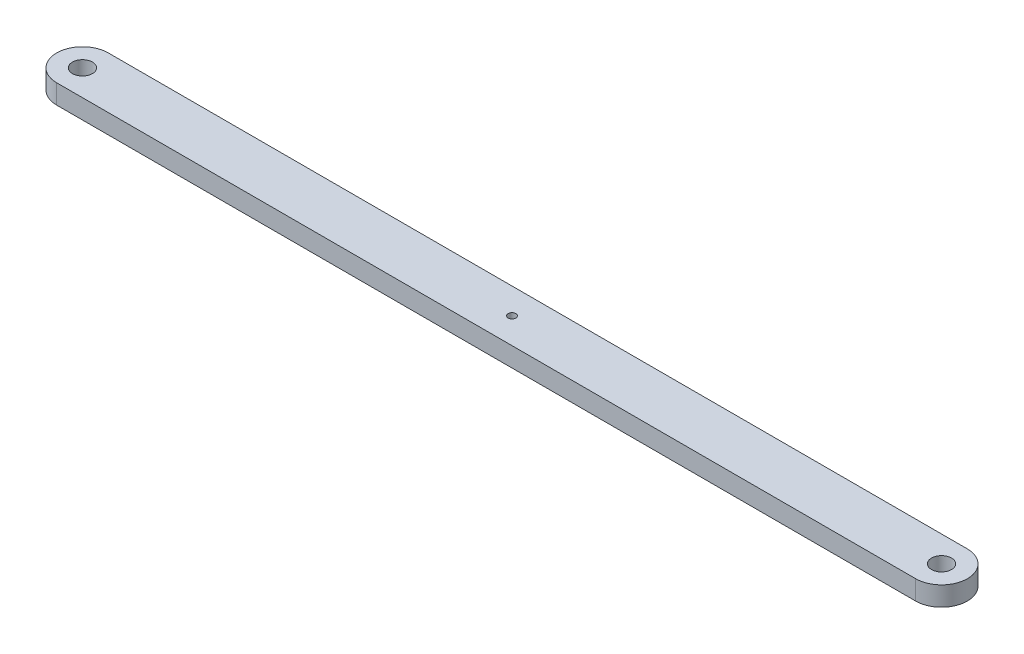
ISO-10303-21;
HEADER;
FILE_DESCRIPTION(('STEP AP214'),'2;1');
FILE_NAME('part.step','',(''),(''),'','','');
FILE_SCHEMA(('AUTOMOTIVE_DESIGN { 1 0 10303 214 1 1 1 1 }'));
ENDSEC;
DATA;
#1=APPLICATION_CONTEXT('core data for automotive mechanical design processes');
#2=APPLICATION_PROTOCOL_DEFINITION('international standard','automotive_design',2000,#1);
#3=PRODUCT_CONTEXT('',#1,'mechanical');
#4=PRODUCT('Part','Part','',(#3));
#5=PRODUCT_RELATED_PRODUCT_CATEGORY('part','',(#4));
#6=PRODUCT_DEFINITION_FORMATION('','',#4);
#7=PRODUCT_DEFINITION_CONTEXT('part definition',#1,'design');
#8=PRODUCT_DEFINITION('design','',#6,#7);
#9=PRODUCT_DEFINITION_SHAPE('','',#8);
#10=(LENGTH_UNIT() NAMED_UNIT(*) SI_UNIT(.MILLI.,.METRE.));
#11=(NAMED_UNIT(*) PLANE_ANGLE_UNIT() SI_UNIT($,.RADIAN.));
#12=(NAMED_UNIT(*) SI_UNIT($,.STERADIAN.) SOLID_ANGLE_UNIT());
#13=UNCERTAINTY_MEASURE_WITH_UNIT(LENGTH_MEASURE(1.E-05),#10,'distance_accuracy_value','');
#14=(GEOMETRIC_REPRESENTATION_CONTEXT(3) GLOBAL_UNCERTAINTY_ASSIGNED_CONTEXT((#13)) GLOBAL_UNIT_ASSIGNED_CONTEXT((#10,
#11,#12)) REPRESENTATION_CONTEXT('',''));
#15=CARTESIAN_POINT('',(0.,0.,0.));
#16=DIRECTION('',(0.,0.,1.));
#17=DIRECTION('',(1.,0.,0.));
#18=AXIS2_PLACEMENT_3D('',#15,#16,#17);
#19=CARTESIAN_POINT('',(66.5,3.,0.));
#20=DIRECTION('',(0.,-1.,0.));
#21=DIRECTION('',(0.,0.,-1.));
#22=AXIS2_PLACEMENT_3D('',#19,#20,#21);
#23=PLANE('',#22);
#24=CARTESIAN_POINT('',(0.,3.,0.));
#25=DIRECTION('',(0.,1.,0.));
#26=DIRECTION('',(0.,0.,1.));
#27=AXIS2_PLACEMENT_3D('',#24,#25,#26);
#28=CIRCLE('',#27,0.6);
#29=CARTESIAN_POINT('',(0.,3.,0.6));
#30=VERTEX_POINT('',#29);
#31=EDGE_CURVE('E131',#30,#30,#28,.T.);
#32=ORIENTED_EDGE('',*,*,#31,.F.);
#33=EDGE_LOOP('',(#32));
#34=FACE_BOUND('',#33,.T.);
#35=CARTESIAN_POINT('',(66.5,3.,0.));
#36=DIRECTION('',(0.,1.,0.));
#37=DIRECTION('',(0.,0.,-1.));
#38=AXIS2_PLACEMENT_3D('',#35,#36,#37);
#39=CIRCLE('',#38,3.99999999999534);
#40=CARTESIAN_POINT('',(66.5,3.,3.99999999999534));
#41=VERTEX_POINT('',#40);
#42=CARTESIAN_POINT('',(66.5,3.,-3.99999999999534));
#43=VERTEX_POINT('',#42);
#44=EDGE_CURVE('E92',#41,#43,#39,.T.);
#45=ORIENTED_EDGE('',*,*,#44,.T.);
#46=DIRECTION('',(-1.,0.,0.));
#47=VECTOR('',#46,1.);
#48=CARTESIAN_POINT('',(-66.5,3.,-3.99999999999535));
#49=LINE('',#48,#47);
#50=CARTESIAN_POINT('',(-66.5,3.,-3.99999999999535));
#51=VERTEX_POINT('',#50);
#52=EDGE_CURVE('E87',#43,#51,#49,.T.);
#53=ORIENTED_EDGE('',*,*,#52,.T.);
#54=CARTESIAN_POINT('',(-66.5,3.,0.));
#55=DIRECTION('',(0.,1.,0.));
#56=DIRECTION('',(0.,0.,1.));
#57=AXIS2_PLACEMENT_3D('',#54,#55,#56);
#58=CIRCLE('',#57,3.99999999999535);
#59=CARTESIAN_POINT('',(-66.5,3.,3.99999999999535));
#60=VERTEX_POINT('',#59);
#61=EDGE_CURVE('E90',#51,#60,#58,.T.);
#62=ORIENTED_EDGE('',*,*,#61,.T.);
#63=DIRECTION('',(1.,0.,0.));
#64=VECTOR('',#63,1.);
#65=CARTESIAN_POINT('',(66.5,3.,3.99999999999534));
#66=LINE('',#65,#64);
#67=EDGE_CURVE('E57',#60,#41,#66,.T.);
#68=ORIENTED_EDGE('',*,*,#67,.T.);
#69=EDGE_LOOP('',(#45,#53,#62,#68));
#70=FACE_BOUND('',#69,.T.);
#71=CARTESIAN_POINT('',(-66.5,3.,0.));
#72=DIRECTION('',(0.,1.,0.));
#73=DIRECTION('',(0.,0.,1.));
#74=AXIS2_PLACEMENT_3D('',#71,#72,#73);
#75=CIRCLE('',#74,1.54999999999999);
#76=CARTESIAN_POINT('',(-66.5,3.,1.55));
#77=VERTEX_POINT('',#76);
#78=EDGE_CURVE('E108',#77,#77,#75,.T.);
#79=ORIENTED_EDGE('',*,*,#78,.F.);
#80=EDGE_LOOP('',(#79));
#81=FACE_BOUND('',#80,.T.);
#82=CARTESIAN_POINT('',(66.5,3.,0.));
#83=DIRECTION('',(0.,1.,0.));
#84=DIRECTION('',(0.,0.,-1.));
#85=AXIS2_PLACEMENT_3D('',#82,#83,#84);
#86=CIRCLE('',#85,1.54999999999999);
#87=CARTESIAN_POINT('',(66.5,3.,-1.54999999999999));
#88=VERTEX_POINT('',#87);
#89=EDGE_CURVE('E123',#88,#88,#86,.T.);
#90=ORIENTED_EDGE('',*,*,#89,.F.);
#91=EDGE_LOOP('',(#90));
#92=FACE_BOUND('',#91,.T.);
#93=ADVANCED_FACE('F39',(#34,#70,#81,#92),#23,.F.);
#94=CARTESIAN_POINT('',(66.5,0.,0.));
#95=DIRECTION('',(0.,-1.,0.));
#96=DIRECTION('',(0.,0.,-1.));
#97=AXIS2_PLACEMENT_3D('',#94,#95,#96);
#98=PLANE('',#97);
#99=CARTESIAN_POINT('',(0.,0.,0.));
#100=DIRECTION('',(0.,-1.,0.));
#101=DIRECTION('',(0.,0.,-1.));
#102=AXIS2_PLACEMENT_3D('',#99,#100,#101);
#103=CIRCLE('',#102,0.6);
#104=CARTESIAN_POINT('',(0.,0.,-0.6));
#105=VERTEX_POINT('',#104);
#106=EDGE_CURVE('E43',#105,#105,#103,.T.);
#107=ORIENTED_EDGE('',*,*,#106,.F.);
#108=EDGE_LOOP('',(#107));
#109=FACE_BOUND('',#108,.T.);
#110=CARTESIAN_POINT('',(-66.5,0.,0.));
#111=DIRECTION('',(0.,1.,0.));
#112=DIRECTION('',(0.,0.,1.));
#113=AXIS2_PLACEMENT_3D('',#110,#111,#112);
#114=CIRCLE('',#113,1.54999999999999);
#115=CARTESIAN_POINT('',(-66.5,0.,1.55));
#116=VERTEX_POINT('',#115);
#117=EDGE_CURVE('E120',#116,#116,#114,.T.);
#118=ORIENTED_EDGE('',*,*,#117,.T.);
#119=EDGE_LOOP('',(#118));
#120=FACE_BOUND('',#119,.T.);
#121=CARTESIAN_POINT('',(66.5,0.,0.));
#122=DIRECTION('',(0.,1.,0.));
#123=DIRECTION('',(0.,0.,-1.));
#124=AXIS2_PLACEMENT_3D('',#121,#122,#123);
#125=CIRCLE('',#124,3.99999999999534);
#126=CARTESIAN_POINT('',(66.5,0.,3.99999999999534));
#127=VERTEX_POINT('',#126);
#128=CARTESIAN_POINT('',(66.5,0.,-3.99999999999534));
#129=VERTEX_POINT('',#128);
#130=EDGE_CURVE('E105',#127,#129,#125,.T.);
#131=ORIENTED_EDGE('',*,*,#130,.F.);
#132=DIRECTION('',(1.,0.,0.));
#133=VECTOR('',#132,1.);
#134=CARTESIAN_POINT('',(66.5,0.,3.99999999999534));
#135=LINE('',#134,#133);
#136=CARTESIAN_POINT('',(-66.5,0.,3.99999999999535));
#137=VERTEX_POINT('',#136);
#138=EDGE_CURVE('E80',#137,#127,#135,.T.);
#139=ORIENTED_EDGE('',*,*,#138,.F.);
#140=CARTESIAN_POINT('',(-66.5,0.,0.));
#141=DIRECTION('',(0.,1.,0.));
#142=DIRECTION('',(0.,0.,1.));
#143=AXIS2_PLACEMENT_3D('',#140,#141,#142);
#144=CIRCLE('',#143,3.99999999999535);
#145=CARTESIAN_POINT('',(-66.5,0.,-3.99999999999535));
#146=VERTEX_POINT('',#145);
#147=EDGE_CURVE('E74',#146,#137,#144,.T.);
#148=ORIENTED_EDGE('',*,*,#147,.F.);
#149=DIRECTION('',(-1.,0.,0.));
#150=VECTOR('',#149,1.);
#151=CARTESIAN_POINT('',(-66.5,0.,-3.99999999999535));
#152=LINE('',#151,#150);
#153=EDGE_CURVE('E96',#129,#146,#152,.T.);
#154=ORIENTED_EDGE('',*,*,#153,.F.);
#155=EDGE_LOOP('',(#131,#139,#148,#154));
#156=FACE_BOUND('',#155,.T.);
#157=CARTESIAN_POINT('',(66.5,0.,0.));
#158=DIRECTION('',(0.,1.,0.));
#159=DIRECTION('',(0.,0.,-1.));
#160=AXIS2_PLACEMENT_3D('',#157,#158,#159);
#161=CIRCLE('',#160,1.54999999999999);
#162=CARTESIAN_POINT('',(66.5,0.,-1.54999999999999));
#163=VERTEX_POINT('',#162);
#164=EDGE_CURVE('E126',#163,#163,#161,.T.);
#165=ORIENTED_EDGE('',*,*,#164,.T.);
#166=EDGE_LOOP('',(#165));
#167=FACE_BOUND('',#166,.T.);
#168=ADVANCED_FACE('F116',(#109,#120,#156,#167),#98,.T.);
#169=CARTESIAN_POINT('',(66.5,3.,0.));
#170=DIRECTION('',(0.,-1.,0.));
#171=DIRECTION('',(0.,0.,-1.));
#172=AXIS2_PLACEMENT_3D('',#169,#170,#171);
#173=CYLINDRICAL_SURFACE('',#172,3.99999999999534);
#174=ORIENTED_EDGE('',*,*,#130,.T.);
#175=DIRECTION('',(0.,-1.,0.));
#176=VECTOR('',#175,1.);
#177=CARTESIAN_POINT('',(66.5,3.,-3.99999999999534));
#178=LINE('',#177,#176);
#179=EDGE_CURVE('E11',#43,#129,#178,.T.);
#180=ORIENTED_EDGE('',*,*,#179,.F.);
#181=ORIENTED_EDGE('',*,*,#44,.F.);
#182=DIRECTION('',(0.,-1.,0.));
#183=VECTOR('',#182,1.);
#184=CARTESIAN_POINT('',(66.5,3.,3.99999999999534));
#185=LINE('',#184,#183);
#186=EDGE_CURVE('E101',#41,#127,#185,.T.);
#187=ORIENTED_EDGE('',*,*,#186,.T.);
#188=EDGE_LOOP('',(#174,#180,#181,#187));
#189=FACE_BOUND('',#188,.T.);
#190=ADVANCED_FACE('F41',(#189),#173,.T.);
#191=CARTESIAN_POINT('',(-66.5,3.,-3.99999999999535));
#192=DIRECTION('',(0.,0.,1.));
#193=DIRECTION('',(1.,0.,0.));
#194=AXIS2_PLACEMENT_3D('',#191,#192,#193);
#195=PLANE('',#194);
#196=ORIENTED_EDGE('',*,*,#153,.T.);
#197=DIRECTION('',(0.,-1.,0.));
#198=VECTOR('',#197,1.);
#199=CARTESIAN_POINT('',(-66.5,3.,-3.99999999999535));
#200=LINE('',#199,#198);
#201=EDGE_CURVE('E49',#51,#146,#200,.T.);
#202=ORIENTED_EDGE('',*,*,#201,.F.);
#203=ORIENTED_EDGE('',*,*,#52,.F.);
#204=ORIENTED_EDGE('',*,*,#179,.T.);
#205=EDGE_LOOP('',(#196,#202,#203,#204));
#206=FACE_BOUND('',#205,.T.);
#207=ADVANCED_FACE('F95',(#206),#195,.F.);
#208=CARTESIAN_POINT('',(-66.5,3.,0.));
#209=DIRECTION('',(0.,-1.,0.));
#210=DIRECTION('',(0.,0.,-1.));
#211=AXIS2_PLACEMENT_3D('',#208,#209,#210);
#212=CYLINDRICAL_SURFACE('',#211,3.99999999999535);
#213=ORIENTED_EDGE('',*,*,#147,.T.);
#214=DIRECTION('',(0.,-1.,0.));
#215=VECTOR('',#214,1.);
#216=CARTESIAN_POINT('',(-66.5,3.,3.99999999999535));
#217=LINE('',#216,#215);
#218=EDGE_CURVE('E97',#60,#137,#217,.T.);
#219=ORIENTED_EDGE('',*,*,#218,.F.);
#220=ORIENTED_EDGE('',*,*,#61,.F.);
#221=ORIENTED_EDGE('',*,*,#201,.T.);
#222=EDGE_LOOP('',(#213,#219,#220,#221));
#223=FACE_BOUND('',#222,.T.);
#224=ADVANCED_FACE('F99',(#223),#212,.T.);
#225=CARTESIAN_POINT('',(66.5,3.,3.99999999999534));
#226=DIRECTION('',(0.,0.,-1.));
#227=DIRECTION('',(-1.,0.,0.));
#228=AXIS2_PLACEMENT_3D('',#225,#226,#227);
#229=PLANE('',#228);
#230=ORIENTED_EDGE('',*,*,#138,.T.);
#231=ORIENTED_EDGE('',*,*,#186,.F.);
#232=ORIENTED_EDGE('',*,*,#67,.F.);
#233=ORIENTED_EDGE('',*,*,#218,.T.);
#234=EDGE_LOOP('',(#230,#231,#232,#233));
#235=FACE_BOUND('',#234,.T.);
#236=ADVANCED_FACE('F113',(#235),#229,.F.);
#237=CARTESIAN_POINT('',(-66.5,3.,0.));
#238=DIRECTION('',(0.,-1.,0.));
#239=DIRECTION('',(0.,0.,-1.));
#240=AXIS2_PLACEMENT_3D('',#237,#238,#239);
#241=CYLINDRICAL_SURFACE('',#240,1.54999999999999);
#242=ORIENTED_EDGE('',*,*,#78,.T.);
#243=EDGE_LOOP('',(#242));
#244=FACE_BOUND('',#243,.T.);
#245=ORIENTED_EDGE('',*,*,#117,.F.);
#246=EDGE_LOOP('',(#245));
#247=FACE_BOUND('',#246,.T.);
#248=ADVANCED_FACE('F145',(#244,#247),#241,.F.);
#249=CARTESIAN_POINT('',(66.5,3.,0.));
#250=DIRECTION('',(0.,-1.,0.));
#251=DIRECTION('',(0.,0.,-1.));
#252=AXIS2_PLACEMENT_3D('',#249,#250,#251);
#253=CYLINDRICAL_SURFACE('',#252,1.54999999999999);
#254=ORIENTED_EDGE('',*,*,#89,.T.);
#255=EDGE_LOOP('',(#254));
#256=FACE_BOUND('',#255,.T.);
#257=ORIENTED_EDGE('',*,*,#164,.F.);
#258=EDGE_LOOP('',(#257));
#259=FACE_BOUND('',#258,.T.);
#260=ADVANCED_FACE('F147',(#256,#259),#253,.F.);
#261=CARTESIAN_POINT('',(0.,-1.2E-05,0.));
#262=DIRECTION('',(0.,1.,0.));
#263=DIRECTION('',(0.,0.,1.));
#264=AXIS2_PLACEMENT_3D('',#261,#262,#263);
#265=CYLINDRICAL_SURFACE('',#264,0.6);
#266=ORIENTED_EDGE('',*,*,#106,.T.);
#267=EDGE_LOOP('',(#266));
#268=FACE_BOUND('',#267,.T.);
#269=ORIENTED_EDGE('',*,*,#31,.T.);
#270=EDGE_LOOP('',(#269));
#271=FACE_BOUND('',#270,.T.);
#272=ADVANCED_FACE('F138',(#268,#271),#265,.F.);
#273=CLOSED_SHELL('',(#93,#168,#190,#207,#224,#236,#248,#260,#272));
#274=MANIFOLD_SOLID_BREP('B2',#273);
#275=ADVANCED_BREP_SHAPE_REPRESENTATION('',(#18,#274),#14);
#276=SHAPE_DEFINITION_REPRESENTATION(#9,#275);
ENDSEC;
END-ISO-10303-21;
